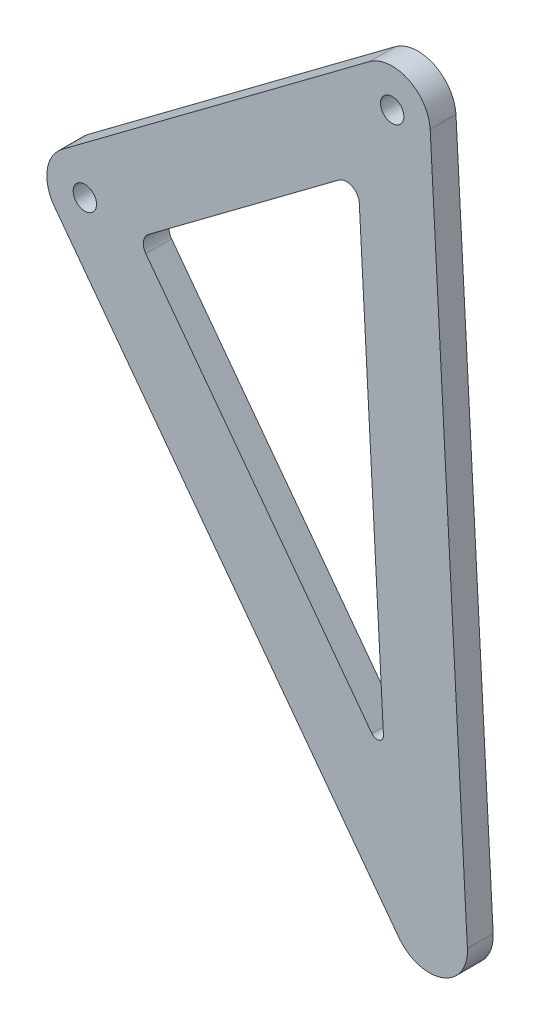
ISO-10303-21;
HEADER;
FILE_DESCRIPTION(('STEP AP214'),'2;1');
FILE_NAME('part.step','',(''),(''),'','','');
FILE_SCHEMA(('AUTOMOTIVE_DESIGN { 1 0 10303 214 1 1 1 1 }'));
ENDSEC;
DATA;
#1=APPLICATION_CONTEXT('core data for automotive mechanical design processes');
#2=APPLICATION_PROTOCOL_DEFINITION('international standard','automotive_design',2000,#1);
#3=PRODUCT_CONTEXT('',#1,'mechanical');
#4=PRODUCT('Part','Part','',(#3));
#5=PRODUCT_RELATED_PRODUCT_CATEGORY('part','',(#4));
#6=PRODUCT_DEFINITION_FORMATION('','',#4);
#7=PRODUCT_DEFINITION_CONTEXT('part definition',#1,'design');
#8=PRODUCT_DEFINITION('design','',#6,#7);
#9=PRODUCT_DEFINITION_SHAPE('','',#8);
#10=(LENGTH_UNIT() NAMED_UNIT(*) SI_UNIT(.MILLI.,.METRE.));
#11=(NAMED_UNIT(*) PLANE_ANGLE_UNIT() SI_UNIT($,.RADIAN.));
#12=(NAMED_UNIT(*) SI_UNIT($,.STERADIAN.) SOLID_ANGLE_UNIT());
#13=UNCERTAINTY_MEASURE_WITH_UNIT(LENGTH_MEASURE(1.E-05),#10,'distance_accuracy_value','');
#14=(GEOMETRIC_REPRESENTATION_CONTEXT(3) GLOBAL_UNCERTAINTY_ASSIGNED_CONTEXT((#13)) GLOBAL_UNIT_ASSIGNED_CONTEXT((#10,
#11,#12)) REPRESENTATION_CONTEXT('',''));
#15=CARTESIAN_POINT('',(0.,0.,0.));
#16=DIRECTION('',(0.,0.,1.));
#17=DIRECTION('',(1.,0.,0.));
#18=AXIS2_PLACEMENT_3D('',#15,#16,#17);
#19=CARTESIAN_POINT('',(134.353836065271,7.23649597476711,5.08));
#20=DIRECTION('',(-0.998552619120662,-0.0537835183607955,0.));
#21=DIRECTION('',(0.0537835183607955,-0.998552619120662,0.));
#22=AXIS2_PLACEMENT_3D('',#19,#20,#21);
#23=PLANE('',#22);
#24=DIRECTION('',(-0.0537835183607955,0.998552619120662,0.));
#25=VECTOR('',#24,1.);
#26=CARTESIAN_POINT('',(134.353836065271,7.23649597476711,0.));
#27=LINE('',#26,#25);
#28=CARTESIAN_POINT('',(133.206299189371,28.5418324029494,0.));
#29=VERTEX_POINT('',#28);
#30=CARTESIAN_POINT('',(128.44298424529,116.978229984838,0.));
#31=VERTEX_POINT('',#30);
#32=EDGE_CURVE('E202',#29,#31,#27,.T.);
#33=ORIENTED_EDGE('',*,*,#32,.F.);
#34=DIRECTION('',(0.,0.,-1.));
#35=VECTOR('',#34,1.);
#36=CARTESIAN_POINT('',(133.206299189371,28.5418324029494,5.08));
#37=LINE('',#36,#35);
#38=CARTESIAN_POINT('',(133.206299189371,28.5418324029494,5.08));
#39=VERTEX_POINT('',#38);
#40=EDGE_CURVE('E11',#39,#29,#37,.T.);
#41=ORIENTED_EDGE('',*,*,#40,.F.);
#42=DIRECTION('',(-0.0537835183607955,0.998552619120662,0.));
#43=VECTOR('',#42,1.);
#44=CARTESIAN_POINT('',(134.353836065271,7.23649597476711,5.08));
#45=LINE('',#44,#43);
#46=CARTESIAN_POINT('',(128.44298424529,116.978229984838,5.08));
#47=VERTEX_POINT('',#46);
#48=EDGE_CURVE('E292',#39,#47,#45,.T.);
#49=ORIENTED_EDGE('',*,*,#48,.T.);
#50=DIRECTION('',(0.,0.,-1.));
#51=VECTOR('',#50,1.);
#52=CARTESIAN_POINT('',(128.44298424529,116.978229984838,5.08));
#53=LINE('',#52,#51);
#54=EDGE_CURVE('E61',#47,#31,#53,.T.);
#55=ORIENTED_EDGE('',*,*,#54,.T.);
#56=EDGE_LOOP('',(#33,#41,#49,#55));
#57=FACE_BOUND('',#56,.T.);
#58=ADVANCED_FACE('F41',(#57),#23,.T.);
#59=CARTESIAN_POINT('',(131.938137363087,28.4735273346311,5.08));
#60=DIRECTION('',(0.,0.,-1.));
#61=DIRECTION('',(-1.,0.,0.));
#62=AXIS2_PLACEMENT_3D('',#59,#60,#61);
#63=CYLINDRICAL_SURFACE('',#62,1.27);
#64=CARTESIAN_POINT('',(131.938137363087,28.4735273346311,0.));
#65=DIRECTION('',(0.,0.,1.));
#66=DIRECTION('',(1.,0.,0.));
#67=AXIS2_PLACEMENT_3D('',#64,#65,#66);
#68=CIRCLE('',#67,1.27);
#69=CARTESIAN_POINT('',(130.92085177706,27.7132444685476,0.));
#70=VERTEX_POINT('',#69);
#71=EDGE_CURVE('E205',#29,#70,#68,.F.);
#72=ORIENTED_EDGE('',*,*,#71,.T.);
#73=DIRECTION('',(0.,0.,-1.));
#74=VECTOR('',#73,1.);
#75=CARTESIAN_POINT('',(130.92085177706,27.7132444685476,5.08));
#76=LINE('',#75,#74);
#77=CARTESIAN_POINT('',(130.92085177706,27.7132444685476,5.08));
#78=VERTEX_POINT('',#77);
#79=EDGE_CURVE('E52',#78,#70,#76,.T.);
#80=ORIENTED_EDGE('',*,*,#79,.F.);
#81=CARTESIAN_POINT('',(131.938137363087,28.4735273346311,5.08));
#82=DIRECTION('',(0.,0.,1.));
#83=DIRECTION('',(1.,0.,0.));
#84=AXIS2_PLACEMENT_3D('',#81,#82,#83);
#85=CIRCLE('',#84,1.27);
#86=EDGE_CURVE('E295',#39,#78,#85,.F.);
#87=ORIENTED_EDGE('',*,*,#86,.F.);
#88=ORIENTED_EDGE('',*,*,#40,.T.);
#89=EDGE_LOOP('',(#72,#80,#87,#88));
#90=FACE_BOUND('',#89,.T.);
#91=ADVANCED_FACE('F317',(#90),#63,.F.);
#92=CARTESIAN_POINT('',(97.2906985507178,72.7115887154625,5.08));
#93=DIRECTION('',(0.801012272462756,0.598647926050071,0.));
#94=DIRECTION('',(-0.598647926050071,0.801012272462756,0.));
#95=AXIS2_PLACEMENT_3D('',#92,#93,#94);
#96=PLANE('',#95);
#97=DIRECTION('',(0.598647926050071,-0.801012272462756,0.));
#98=VECTOR('',#97,1.);
#99=CARTESIAN_POINT('',(97.2906985507178,72.7115887154625,0.));
#100=LINE('',#99,#98);
#101=CARTESIAN_POINT('',(86.3846442614368,87.3042782575431,0.));
#102=VERTEX_POINT('',#101);
#103=EDGE_CURVE('E209',#102,#70,#100,.T.);
#104=ORIENTED_EDGE('',*,*,#103,.F.);
#105=DIRECTION('',(0.,0.,-1.));
#106=VECTOR('',#105,1.);
#107=CARTESIAN_POINT('',(86.3846442614368,87.3042782575431,5.08));
#108=LINE('',#107,#106);
#109=CARTESIAN_POINT('',(86.3846442614368,87.3042782575431,5.08));
#110=VERTEX_POINT('',#109);
#111=EDGE_CURVE('E148',#110,#102,#108,.T.);
#112=ORIENTED_EDGE('',*,*,#111,.F.);
#113=DIRECTION('',(0.598647926050071,-0.801012272462756,0.));
#114=VECTOR('',#113,1.);
#115=CARTESIAN_POINT('',(97.2906985507178,72.7115887154625,5.08));
#116=LINE('',#115,#114);
#117=EDGE_CURVE('E158',#110,#78,#116,.T.);
#118=ORIENTED_EDGE('',*,*,#117,.T.);
#119=ORIENTED_EDGE('',*,*,#79,.T.);
#120=EDGE_LOOP('',(#104,#112,#118,#119));
#121=FACE_BOUND('',#120,.T.);
#122=ADVANCED_FACE('F300',(#121),#96,.T.);
#123=CARTESIAN_POINT('',(88.4192154334922,88.8248439897103,5.08));
#124=DIRECTION('',(0.,0.,-1.));
#125=DIRECTION('',(-1.,0.,0.));
#126=AXIS2_PLACEMENT_3D('',#123,#124,#125);
#127=CYLINDRICAL_SURFACE('',#126,2.54);
#128=CARTESIAN_POINT('',(88.4192154334922,88.8248439897103,0.));
#129=DIRECTION('',(0.,0.,1.));
#130=DIRECTION('',(1.,0.,0.));
#131=AXIS2_PLACEMENT_3D('',#128,#129,#130);
#132=CIRCLE('',#131,2.54);
#133=CARTESIAN_POINT('',(86.898649701325,90.8594151617657,0.));
#134=VERTEX_POINT('',#133);
#135=EDGE_CURVE('E143',#134,#102,#132,.T.);
#136=ORIENTED_EDGE('',*,*,#135,.F.);
#137=DIRECTION('',(0.,0.,-1.));
#138=VECTOR('',#137,1.);
#139=CARTESIAN_POINT('',(86.898649701325,90.8594151617657,5.08));
#140=LINE('',#139,#138);
#141=CARTESIAN_POINT('',(86.898649701325,90.8594151617657,5.08));
#142=VERTEX_POINT('',#141);
#143=EDGE_CURVE('E138',#142,#134,#140,.T.);
#144=ORIENTED_EDGE('',*,*,#143,.F.);
#145=CARTESIAN_POINT('',(88.4192154334922,88.8248439897103,5.08));
#146=DIRECTION('',(0.,0.,1.));
#147=DIRECTION('',(1.,0.,0.));
#148=AXIS2_PLACEMENT_3D('',#145,#146,#147);
#149=CIRCLE('',#148,2.54);
#150=EDGE_CURVE('E141',#142,#110,#149,.T.);
#151=ORIENTED_EDGE('',*,*,#150,.T.);
#152=ORIENTED_EDGE('',*,*,#111,.T.);
#153=EDGE_LOOP('',(#136,#144,#151,#152));
#154=FACE_BOUND('',#153,.T.);
#155=ADVANCED_FACE('F140',(#154),#127,.F.);
#156=CARTESIAN_POINT('',(-12.4266200214481,16.627260714136,5.08));
#157=DIRECTION('',(0.598647926050072,-0.801012272462755,0.));
#158=DIRECTION('',(0.801012272462755,0.598647926050072,0.));
#159=AXIS2_PLACEMENT_3D('',#156,#157,#158);
#160=PLANE('',#159);
#161=DIRECTION('',(-0.801012272462756,-0.598647926050072,0.));
#162=VECTOR('',#161,1.);
#163=CARTESIAN_POINT('',(-12.4266200214481,16.627260714136,0.));
#164=LINE('',#163,#162);
#165=CARTESIAN_POINT('',(124.386094860556,118.876191020257,0.));
#166=VERTEX_POINT('',#165);
#167=EDGE_CURVE('E215',#166,#134,#164,.T.);
#168=ORIENTED_EDGE('',*,*,#167,.F.);
#169=DIRECTION('',(0.,0.,-1.));
#170=VECTOR('',#169,1.);
#171=CARTESIAN_POINT('',(124.386094860556,118.876191020257,5.08));
#172=LINE('',#171,#170);
#173=CARTESIAN_POINT('',(124.386094860556,118.876191020257,5.08));
#174=VERTEX_POINT('',#173);
#175=EDGE_CURVE('E98',#174,#166,#172,.T.);
#176=ORIENTED_EDGE('',*,*,#175,.F.);
#177=DIRECTION('',(-0.801012272462756,-0.598647926050072,0.));
#178=VECTOR('',#177,1.);
#179=CARTESIAN_POINT('',(-12.4266200214481,16.627260714136,5.08));
#180=LINE('',#179,#178);
#181=EDGE_CURVE('E156',#174,#142,#180,.T.);
#182=ORIENTED_EDGE('',*,*,#181,.T.);
#183=ORIENTED_EDGE('',*,*,#143,.T.);
#184=EDGE_LOOP('',(#168,#176,#182,#183));
#185=FACE_BOUND('',#184,.T.);
#186=ADVANCED_FACE('F161',(#185),#160,.T.);
#187=CARTESIAN_POINT('',(-21.4063389121992,28.6424448010773,5.08));
#188=DIRECTION('',(-0.598647926050072,0.801012272462756,0.));
#189=DIRECTION('',(-0.801012272462756,-0.598647926050072,0.));
#190=AXIS2_PLACEMENT_3D('',#187,#188,#189);
#191=PLANE('',#190);
#192=DIRECTION('',(0.801012272462756,0.598647926050072,0.));
#193=VECTOR('',#192,1.);
#194=CARTESIAN_POINT('',(-21.4063389121992,28.6424448010773,0.));
#195=LINE('',#194,#193);
#196=CARTESIAN_POINT('',(69.8767675950485,96.8641740711648,0.));
#197=VERTEX_POINT('',#196);
#198=CARTESIAN_POINT('',(130.433295393233,142.12195728055,0.));
#199=VERTEX_POINT('',#198);
#200=EDGE_CURVE('E178',#197,#199,#195,.T.);
#201=ORIENTED_EDGE('',*,*,#200,.F.);
#202=DIRECTION('',(0.,0.,-1.));
#203=VECTOR('',#202,1.);
#204=CARTESIAN_POINT('',(69.8767675950485,96.8641740711648,5.08));
#205=LINE('',#204,#203);
#206=CARTESIAN_POINT('',(69.8767675950485,96.8641740711648,5.08));
#207=VERTEX_POINT('',#206);
#208=EDGE_CURVE('E45',#207,#197,#205,.T.);
#209=ORIENTED_EDGE('',*,*,#208,.F.);
#210=DIRECTION('',(0.801012272462756,0.598647926050072,0.));
#211=VECTOR('',#210,1.);
#212=CARTESIAN_POINT('',(-21.4063389121992,28.6424448010773,5.08));
#213=LINE('',#212,#211);
#214=CARTESIAN_POINT('',(130.433295393233,142.12195728055,5.08));
#215=VERTEX_POINT('',#214);
#216=EDGE_CURVE('E260',#207,#215,#213,.T.);
#217=ORIENTED_EDGE('',*,*,#216,.T.);
#218=DIRECTION('',(0.,0.,-1.));
#219=VECTOR('',#218,1.);
#220=CARTESIAN_POINT('',(130.433295393233,142.12195728055,5.08));
#221=LINE('',#220,#219);
#222=EDGE_CURVE('E166',#215,#199,#221,.T.);
#223=ORIENTED_EDGE('',*,*,#222,.T.);
#224=EDGE_LOOP('',(#201,#209,#217,#223));
#225=FACE_BOUND('',#224,.T.);
#226=ADVANCED_FACE('F258',(#225),#191,.T.);
#227=CARTESIAN_POINT('',(74.3666270404231,90.8565820276941,5.08));
#228=DIRECTION('',(0.,0.,-1.));
#229=DIRECTION('',(-1.,0.,0.));
#230=AXIS2_PLACEMENT_3D('',#227,#228,#229);
#231=CYLINDRICAL_SURFACE('',#230,7.49999999999976);
#232=CARTESIAN_POINT('',(74.3666270404231,90.8565820276941,0.));
#233=DIRECTION('',(0.,0.,1.));
#234=DIRECTION('',(1.,0.,0.));
#235=AXIS2_PLACEMENT_3D('',#232,#233,#234);
#236=CIRCLE('',#235,7.49999999999976);
#237=CARTESIAN_POINT('',(68.3590349969524,86.3667225823185,0.));
#238=VERTEX_POINT('',#237);
#239=EDGE_CURVE('E182',#197,#238,#236,.T.);
#240=ORIENTED_EDGE('',*,*,#239,.T.);
#241=DIRECTION('',(0.,0.,-1.));
#242=VECTOR('',#241,1.);
#243=CARTESIAN_POINT('',(68.3590349969524,86.3667225823185,5.08));
#244=LINE('',#243,#242);
#245=CARTESIAN_POINT('',(68.3590349969524,86.3667225823185,5.08));
#246=VERTEX_POINT('',#245);
#247=EDGE_CURVE('E241',#246,#238,#244,.T.);
#248=ORIENTED_EDGE('',*,*,#247,.F.);
#249=CARTESIAN_POINT('',(74.3666270404231,90.8565820276941,5.08));
#250=DIRECTION('',(0.,0.,1.));
#251=DIRECTION('',(1.,0.,0.));
#252=AXIS2_PLACEMENT_3D('',#249,#250,#251);
#253=CIRCLE('',#252,7.49999999999976);
#254=EDGE_CURVE('E251',#207,#246,#253,.T.);
#255=ORIENTED_EDGE('',*,*,#254,.F.);
#256=ORIENTED_EDGE('',*,*,#208,.T.);
#257=EDGE_LOOP('',(#240,#248,#255,#256));
#258=FACE_BOUND('',#257,.T.);
#259=ADVANCED_FACE('F250',(#258),#231,.T.);
#260=CARTESIAN_POINT('',(85.2755144637764,63.7318698247114,5.08));
#261=DIRECTION('',(-0.801012272462756,-0.598647926050072,0.));
#262=DIRECTION('',(0.598647926050072,-0.801012272462756,0.));
#263=AXIS2_PLACEMENT_3D('',#260,#261,#262);
#264=PLANE('',#263);
#265=DIRECTION('',(-0.598647926050072,0.801012272462756,0.));
#266=VECTOR('',#265,1.);
#267=CARTESIAN_POINT('',(85.2755144637764,63.7318698247114,0.));
#268=LINE('',#267,#266);
#269=CARTESIAN_POINT('',(136.245709811031,-4.46806911495795,0.));
#270=VERTEX_POINT('',#269);
#271=EDGE_CURVE('E186',#270,#238,#268,.T.);
#272=ORIENTED_EDGE('',*,*,#271,.F.);
#273=DIRECTION('',(0.,0.,-1.));
#274=VECTOR('',#273,1.);
#275=CARTESIAN_POINT('',(136.245709811031,-4.46806911495795,5.08));
#276=LINE('',#275,#274);
#277=CARTESIAN_POINT('',(136.245709811031,-4.46806911495795,5.08));
#278=VERTEX_POINT('',#277);
#279=EDGE_CURVE('E239',#278,#270,#276,.T.);
#280=ORIENTED_EDGE('',*,*,#279,.F.);
#281=DIRECTION('',(-0.598647926050072,0.801012272462756,0.));
#282=VECTOR('',#281,1.);
#283=CARTESIAN_POINT('',(85.2755144637764,63.7318698247114,5.08));
#284=LINE('',#283,#282);
#285=EDGE_CURVE('E276',#278,#246,#284,.T.);
#286=ORIENTED_EDGE('',*,*,#285,.T.);
#287=ORIENTED_EDGE('',*,*,#247,.T.);
#288=EDGE_LOOP('',(#272,#280,#286,#287));
#289=FACE_BOUND('',#288,.T.);
#290=ADVANCED_FACE('F274',(#289),#264,.T.);
#291=CARTESIAN_POINT('',(142.253301854502,0.0217903304168821,5.08));
#292=DIRECTION('',(0.,0.,-1.));
#293=DIRECTION('',(-1.,0.,0.));
#294=AXIS2_PLACEMENT_3D('',#291,#292,#293);
#295=CYLINDRICAL_SURFACE('',#294,7.50000000000012);
#296=CARTESIAN_POINT('',(142.253301854502,0.0217903304168821,0.));
#297=DIRECTION('',(0.,0.,1.));
#298=DIRECTION('',(1.,0.,0.));
#299=AXIS2_PLACEMENT_3D('',#296,#297,#298);
#300=CIRCLE('',#299,7.50000000000012);
#301=CARTESIAN_POINT('',(149.742446497907,0.425166718122844,0.));
#302=VERTEX_POINT('',#301);
#303=EDGE_CURVE('E190',#270,#302,#300,.T.);
#304=ORIENTED_EDGE('',*,*,#303,.T.);
#305=DIRECTION('',(0.,0.,-1.));
#306=VECTOR('',#305,1.);
#307=CARTESIAN_POINT('',(149.742446497907,0.425166718122844,5.08));
#308=LINE('',#307,#306);
#309=CARTESIAN_POINT('',(149.742446497907,0.425166718122844,5.08));
#310=VERTEX_POINT('',#309);
#311=EDGE_CURVE('E236',#310,#302,#308,.T.);
#312=ORIENTED_EDGE('',*,*,#311,.F.);
#313=CARTESIAN_POINT('',(142.253301854502,0.0217903304168821,5.08));
#314=DIRECTION('',(0.,0.,1.));
#315=DIRECTION('',(1.,0.,0.));
#316=AXIS2_PLACEMENT_3D('',#313,#314,#315);
#317=CIRCLE('',#316,7.50000000000012);
#318=EDGE_CURVE('E277',#278,#310,#317,.T.);
#319=ORIENTED_EDGE('',*,*,#318,.F.);
#320=ORIENTED_EDGE('',*,*,#279,.T.);
#321=EDGE_LOOP('',(#304,#312,#319,#320));
#322=FACE_BOUND('',#321,.T.);
#323=ADVANCED_FACE('F273',(#322),#295,.T.);
#324=CARTESIAN_POINT('',(149.332125352081,8.04324875017895,5.08));
#325=DIRECTION('',(0.998552619120662,0.0537835183607949,0.));
#326=DIRECTION('',(-0.0537835183607949,0.998552619120662,0.));
#327=AXIS2_PLACEMENT_3D('',#324,#325,#326);
#328=PLANE('',#327);
#329=DIRECTION('',(0.0537835183607949,-0.998552619120662,0.));
#330=VECTOR('',#329,1.);
#331=CARTESIAN_POINT('',(149.332125352081,8.04324875017895,0.));
#332=LINE('',#331,#330);
#333=CARTESIAN_POINT('',(142.412299482013,136.517741624785,0.));
#334=VERTEX_POINT('',#333);
#335=EDGE_CURVE('E194',#334,#302,#332,.T.);
#336=ORIENTED_EDGE('',*,*,#335,.F.);
#337=DIRECTION('',(0.,0.,-1.));
#338=VECTOR('',#337,1.);
#339=CARTESIAN_POINT('',(142.412299482013,136.517741624785,5.08));
#340=LINE('',#339,#338);
#341=CARTESIAN_POINT('',(142.412299482013,136.517741624785,5.08));
#342=VERTEX_POINT('',#341);
#343=EDGE_CURVE('E233',#342,#334,#340,.T.);
#344=ORIENTED_EDGE('',*,*,#343,.F.);
#345=DIRECTION('',(0.0537835183607949,-0.998552619120662,0.));
#346=VECTOR('',#345,1.);
#347=CARTESIAN_POINT('',(149.332125352081,8.04324875017895,5.08));
#348=LINE('',#347,#346);
#349=EDGE_CURVE('E270',#342,#310,#348,.T.);
#350=ORIENTED_EDGE('',*,*,#349,.T.);
#351=ORIENTED_EDGE('',*,*,#311,.T.);
#352=EDGE_LOOP('',(#336,#344,#350,#351));
#353=FACE_BOUND('',#352,.T.);
#354=ADVANCED_FACE('F266',(#353),#328,.T.);
#355=CARTESIAN_POINT('',(134.923154838608,136.114365237079,5.08));
#356=DIRECTION('',(0.,0.,-1.));
#357=DIRECTION('',(-1.,0.,0.));
#358=AXIS2_PLACEMENT_3D('',#355,#356,#357);
#359=CYLINDRICAL_SURFACE('',#358,7.50000000000028);
#360=CARTESIAN_POINT('',(134.923154838608,136.114365237079,0.));
#361=DIRECTION('',(0.,0.,1.));
#362=DIRECTION('',(1.,0.,0.));
#363=AXIS2_PLACEMENT_3D('',#360,#361,#362);
#364=CIRCLE('',#363,7.50000000000028);
#365=EDGE_CURVE('E198',#334,#199,#364,.T.);
#366=ORIENTED_EDGE('',*,*,#365,.T.);
#367=ORIENTED_EDGE('',*,*,#222,.F.);
#368=CARTESIAN_POINT('',(134.923154838608,136.114365237079,5.08));
#369=DIRECTION('',(0.,0.,1.));
#370=DIRECTION('',(1.,0.,0.));
#371=AXIS2_PLACEMENT_3D('',#368,#369,#370);
#372=CIRCLE('',#371,7.50000000000028);
#373=EDGE_CURVE('E289',#342,#215,#372,.T.);
#374=ORIENTED_EDGE('',*,*,#373,.F.);
#375=ORIENTED_EDGE('',*,*,#343,.T.);
#376=EDGE_LOOP('',(#366,#367,#374,#375));
#377=FACE_BOUND('',#376,.T.);
#378=ADVANCED_FACE('F263',(#377),#359,.T.);
#379=CARTESIAN_POINT('',(74.3666270404231,90.8565820276941,5.08));
#380=DIRECTION('',(0.,0.,-1.));
#381=DIRECTION('',(-1.,0.,0.));
#382=AXIS2_PLACEMENT_3D('',#379,#380,#381);
#383=CYLINDRICAL_SURFACE('',#382,2.3);
#384=CARTESIAN_POINT('',(74.3666270404231,90.8565820276941,5.08));
#385=DIRECTION('',(0.,0.,1.));
#386=DIRECTION('',(1.,0.,0.));
#387=AXIS2_PLACEMENT_3D('',#384,#385,#386);
#388=CIRCLE('',#387,2.3);
#389=CARTESIAN_POINT('',(76.6666270404231,90.8565820276941,5.08));
#390=VERTEX_POINT('',#389);
#391=EDGE_CURVE('E344',#390,#390,#388,.T.);
#392=ORIENTED_EDGE('',*,*,#391,.T.);
#393=EDGE_LOOP('',(#392));
#394=FACE_BOUND('',#393,.T.);
#395=CARTESIAN_POINT('',(74.3666270404231,90.8565820276941,0.));
#396=DIRECTION('',(0.,0.,1.));
#397=DIRECTION('',(1.,0.,0.));
#398=AXIS2_PLACEMENT_3D('',#395,#396,#397);
#399=CIRCLE('',#398,2.3);
#400=CARTESIAN_POINT('',(76.6666270404231,90.8565820276941,0.));
#401=VERTEX_POINT('',#400);
#402=EDGE_CURVE('E174',#401,#401,#399,.T.);
#403=ORIENTED_EDGE('',*,*,#402,.F.);
#404=EDGE_LOOP('',(#403));
#405=FACE_BOUND('',#404,.T.);
#406=ADVANCED_FACE('F312',(#394,#405),#383,.F.);
#407=CARTESIAN_POINT('',(134.923154838608,136.114365237079,5.08));
#408=DIRECTION('',(0.,0.,-1.));
#409=DIRECTION('',(-1.,0.,0.));
#410=AXIS2_PLACEMENT_3D('',#407,#408,#409);
#411=CYLINDRICAL_SURFACE('',#410,2.29999999999999);
#412=CARTESIAN_POINT('',(134.923154838608,136.114365237079,5.08));
#413=DIRECTION('',(0.,0.,1.));
#414=DIRECTION('',(1.,0.,0.));
#415=AXIS2_PLACEMENT_3D('',#412,#413,#414);
#416=CIRCLE('',#415,2.29999999999999);
#417=CARTESIAN_POINT('',(137.223154838608,136.114365237079,5.08));
#418=VERTEX_POINT('',#417);
#419=EDGE_CURVE('E222',#418,#418,#416,.T.);
#420=ORIENTED_EDGE('',*,*,#419,.T.);
#421=EDGE_LOOP('',(#420));
#422=FACE_BOUND('',#421,.T.);
#423=CARTESIAN_POINT('',(134.923154838608,136.114365237079,0.));
#424=DIRECTION('',(0.,0.,1.));
#425=DIRECTION('',(1.,0.,0.));
#426=AXIS2_PLACEMENT_3D('',#423,#424,#425);
#427=CIRCLE('',#426,2.29999999999999);
#428=CARTESIAN_POINT('',(137.223154838608,136.114365237079,0.));
#429=VERTEX_POINT('',#428);
#430=EDGE_CURVE('E170',#429,#429,#427,.T.);
#431=ORIENTED_EDGE('',*,*,#430,.F.);
#432=EDGE_LOOP('',(#431));
#433=FACE_BOUND('',#432,.T.);
#434=ADVANCED_FACE('F43',(#422,#433),#411,.F.);
#435=CARTESIAN_POINT('',(125.906660592724,116.841619848202,5.08));
#436=DIRECTION('',(0.,0.,-1.));
#437=DIRECTION('',(-1.,0.,0.));
#438=AXIS2_PLACEMENT_3D('',#435,#436,#437);
#439=CYLINDRICAL_SURFACE('',#438,2.54);
#440=CARTESIAN_POINT('',(125.906660592724,116.841619848202,0.));
#441=DIRECTION('',(0.,0.,1.));
#442=DIRECTION('',(1.,0.,0.));
#443=AXIS2_PLACEMENT_3D('',#440,#441,#442);
#444=CIRCLE('',#443,2.54);
#445=EDGE_CURVE('E218',#31,#166,#444,.T.);
#446=ORIENTED_EDGE('',*,*,#445,.F.);
#447=ORIENTED_EDGE('',*,*,#54,.F.);
#448=CARTESIAN_POINT('',(125.906660592724,116.841619848202,5.08));
#449=DIRECTION('',(0.,0.,1.));
#450=DIRECTION('',(1.,0.,0.));
#451=AXIS2_PLACEMENT_3D('',#448,#449,#450);
#452=CIRCLE('',#451,2.54);
#453=EDGE_CURVE('E163',#47,#174,#452,.T.);
#454=ORIENTED_EDGE('',*,*,#453,.T.);
#455=ORIENTED_EDGE('',*,*,#175,.T.);
#456=EDGE_LOOP('',(#446,#447,#454,#455));
#457=FACE_BOUND('',#456,.T.);
#458=ADVANCED_FACE('F303',(#457),#439,.F.);
#459=CARTESIAN_POINT('',(0.,0.,5.08));
#460=DIRECTION('',(0.,0.,1.));
#461=DIRECTION('',(1.,0.,0.));
#462=AXIS2_PLACEMENT_3D('',#459,#460,#461);
#463=PLANE('',#462);
#464=ORIENTED_EDGE('',*,*,#419,.F.);
#465=EDGE_LOOP('',(#464));
#466=FACE_BOUND('',#465,.T.);
#467=ORIENTED_EDGE('',*,*,#391,.F.);
#468=EDGE_LOOP('',(#467));
#469=FACE_BOUND('',#468,.T.);
#470=ORIENTED_EDGE('',*,*,#216,.F.);
#471=ORIENTED_EDGE('',*,*,#254,.T.);
#472=ORIENTED_EDGE('',*,*,#285,.F.);
#473=ORIENTED_EDGE('',*,*,#318,.T.);
#474=ORIENTED_EDGE('',*,*,#349,.F.);
#475=ORIENTED_EDGE('',*,*,#373,.T.);
#476=EDGE_LOOP('',(#470,#471,#472,#473,#474,#475));
#477=FACE_BOUND('',#476,.T.);
#478=ORIENTED_EDGE('',*,*,#48,.F.);
#479=ORIENTED_EDGE('',*,*,#86,.T.);
#480=ORIENTED_EDGE('',*,*,#117,.F.);
#481=ORIENTED_EDGE('',*,*,#150,.F.);
#482=ORIENTED_EDGE('',*,*,#181,.F.);
#483=ORIENTED_EDGE('',*,*,#453,.F.);
#484=EDGE_LOOP('',(#478,#479,#480,#481,#482,#483));
#485=FACE_BOUND('',#484,.T.);
#486=ADVANCED_FACE('F154',(#466,#469,#477,#485),#463,.T.);
#487=CARTESIAN_POINT('',(0.,0.,0.));
#488=DIRECTION('',(0.,0.,1.));
#489=DIRECTION('',(1.,0.,0.));
#490=AXIS2_PLACEMENT_3D('',#487,#488,#489);
#491=PLANE('',#490);
#492=ORIENTED_EDGE('',*,*,#430,.T.);
#493=EDGE_LOOP('',(#492));
#494=FACE_BOUND('',#493,.T.);
#495=ORIENTED_EDGE('',*,*,#402,.T.);
#496=EDGE_LOOP('',(#495));
#497=FACE_BOUND('',#496,.T.);
#498=ORIENTED_EDGE('',*,*,#200,.T.);
#499=ORIENTED_EDGE('',*,*,#365,.F.);
#500=ORIENTED_EDGE('',*,*,#335,.T.);
#501=ORIENTED_EDGE('',*,*,#303,.F.);
#502=ORIENTED_EDGE('',*,*,#271,.T.);
#503=ORIENTED_EDGE('',*,*,#239,.F.);
#504=EDGE_LOOP('',(#498,#499,#500,#501,#502,#503));
#505=FACE_BOUND('',#504,.T.);
#506=ORIENTED_EDGE('',*,*,#32,.T.);
#507=ORIENTED_EDGE('',*,*,#445,.T.);
#508=ORIENTED_EDGE('',*,*,#167,.T.);
#509=ORIENTED_EDGE('',*,*,#135,.T.);
#510=ORIENTED_EDGE('',*,*,#103,.T.);
#511=ORIENTED_EDGE('',*,*,#71,.F.);
#512=EDGE_LOOP('',(#506,#507,#508,#509,#510,#511));
#513=FACE_BOUND('',#512,.T.);
#514=ADVANCED_FACE('F254',(#494,#497,#505,#513),#491,.F.);
#515=CLOSED_SHELL('',(#58,#91,#122,#155,#186,#226,#259,#290,#323,#354,#378,#406,#434,#458,#486,#514));
#516=MANIFOLD_SOLID_BREP('B2',#515);
#517=ADVANCED_BREP_SHAPE_REPRESENTATION('',(#18,#516),#14);
#518=SHAPE_DEFINITION_REPRESENTATION(#9,#517);
ENDSEC;
END-ISO-10303-21;
